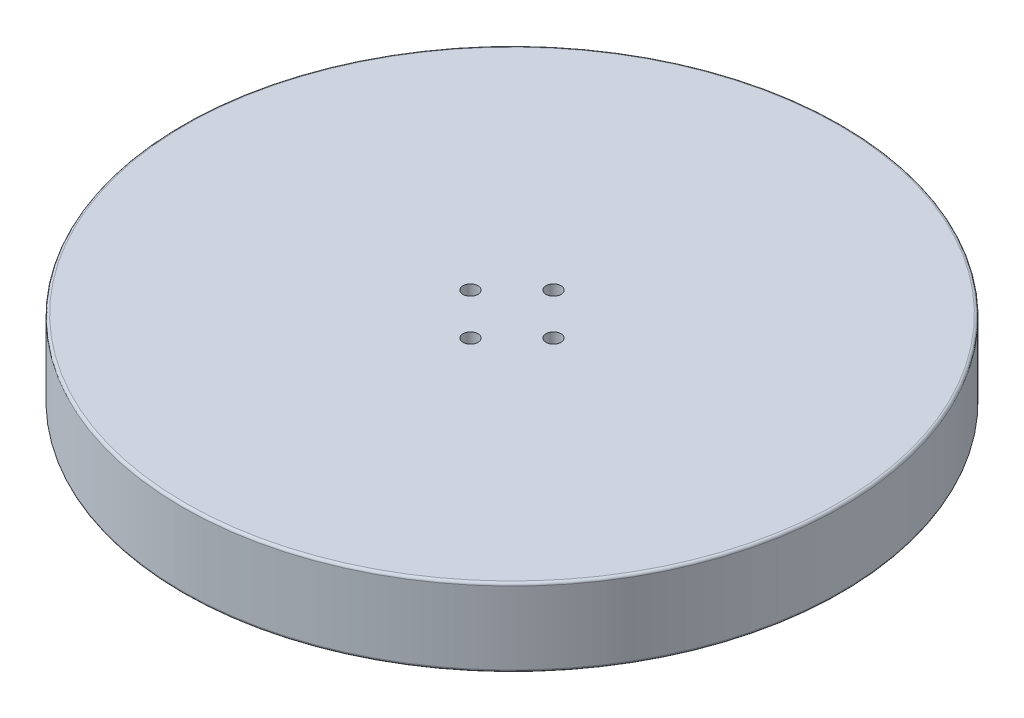
ISO-10303-21;
HEADER;
FILE_DESCRIPTION(('STEP AP214'),'2;1');
FILE_NAME('part.step','',(''),(''),'','','');
FILE_SCHEMA(('AUTOMOTIVE_DESIGN { 1 0 10303 214 1 1 1 1 }'));
ENDSEC;
DATA;
#1=APPLICATION_CONTEXT('core data for automotive mechanical design processes');
#2=APPLICATION_PROTOCOL_DEFINITION('international standard','automotive_design',2000,#1);
#3=PRODUCT_CONTEXT('',#1,'mechanical');
#4=PRODUCT('Part','Part','',(#3));
#5=PRODUCT_RELATED_PRODUCT_CATEGORY('part','',(#4));
#6=PRODUCT_DEFINITION_FORMATION('','',#4);
#7=PRODUCT_DEFINITION_CONTEXT('part definition',#1,'design');
#8=PRODUCT_DEFINITION('design','',#6,#7);
#9=PRODUCT_DEFINITION_SHAPE('','',#8);
#10=(LENGTH_UNIT() NAMED_UNIT(*) SI_UNIT(.MILLI.,.METRE.));
#11=(NAMED_UNIT(*) PLANE_ANGLE_UNIT() SI_UNIT($,.RADIAN.));
#12=(NAMED_UNIT(*) SI_UNIT($,.STERADIAN.) SOLID_ANGLE_UNIT());
#13=UNCERTAINTY_MEASURE_WITH_UNIT(LENGTH_MEASURE(1.E-05),#10,'distance_accuracy_value','');
#14=(GEOMETRIC_REPRESENTATION_CONTEXT(3) GLOBAL_UNCERTAINTY_ASSIGNED_CONTEXT((#13)) GLOBAL_UNIT_ASSIGNED_CONTEXT((#10,
#11,#12)) REPRESENTATION_CONTEXT('',''));
#15=CARTESIAN_POINT('',(0.,0.,0.));
#16=DIRECTION('',(0.,0.,1.));
#17=DIRECTION('',(1.,0.,0.));
#18=AXIS2_PLACEMENT_3D('',#15,#16,#17);
#19=CARTESIAN_POINT('',(0.,15.,0.));
#20=DIRECTION('',(0.,-1.,0.));
#21=DIRECTION('',(0.,0.,-1.));
#22=AXIS2_PLACEMENT_3D('',#19,#20,#21);
#23=CYLINDRICAL_SURFACE('',#22,63.5);
#24=CARTESIAN_POINT('',(0.,14.5,0.));
#25=DIRECTION('',(0.,1.,0.));
#26=DIRECTION('',(0.,0.,1.));
#27=AXIS2_PLACEMENT_3D('',#24,#25,#26);
#28=CIRCLE('',#27,63.5);
#29=CARTESIAN_POINT('',(0.,14.5,63.5));
#30=VERTEX_POINT('',#29);
#31=EDGE_CURVE('E47',#30,#30,#28,.F.);
#32=ORIENTED_EDGE('',*,*,#31,.T.);
#33=EDGE_LOOP('',(#32));
#34=FACE_BOUND('',#33,.T.);
#35=CARTESIAN_POINT('',(0.,0.5,0.));
#36=DIRECTION('',(0.,1.,0.));
#37=DIRECTION('',(0.,0.,1.));
#38=AXIS2_PLACEMENT_3D('',#35,#36,#37);
#39=CIRCLE('',#38,63.5);
#40=CARTESIAN_POINT('',(0.,0.5,63.5));
#41=VERTEX_POINT('',#40);
#42=EDGE_CURVE('E52',#41,#41,#39,.T.);
#43=ORIENTED_EDGE('',*,*,#42,.T.);
#44=EDGE_LOOP('',(#43));
#45=FACE_BOUND('',#44,.T.);
#46=ADVANCED_FACE('F39',(#34,#45),#23,.T.);
#47=CARTESIAN_POINT('',(0.,15.,0.));
#48=DIRECTION('',(0.,1.,0.));
#49=DIRECTION('',(0.,0.,1.));
#50=AXIS2_PLACEMENT_3D('',#47,#48,#49);
#51=PLANE('',#50);
#52=CARTESIAN_POINT('',(0.,15.,0.));
#53=DIRECTION('',(0.,1.,0.));
#54=DIRECTION('',(0.,0.,1.));
#55=AXIS2_PLACEMENT_3D('',#52,#53,#54);
#56=CIRCLE('',#55,63.);
#57=CARTESIAN_POINT('',(0.,15.,63.));
#58=VERTEX_POINT('',#57);
#59=EDGE_CURVE('E57',#58,#58,#56,.T.);
#60=ORIENTED_EDGE('',*,*,#59,.T.);
#61=EDGE_LOOP('',(#60));
#62=FACE_BOUND('',#61,.T.);
#63=CARTESIAN_POINT('',(0.,15.,-8.));
#64=DIRECTION('',(0.,1.,0.));
#65=DIRECTION('',(0.,0.,1.));
#66=AXIS2_PLACEMENT_3D('',#63,#64,#65);
#67=CIRCLE('',#66,1.45);
#68=CARTESIAN_POINT('',(0.,15.,-6.55));
#69=VERTEX_POINT('',#68);
#70=EDGE_CURVE('E88',#69,#69,#67,.T.);
#71=ORIENTED_EDGE('',*,*,#70,.F.);
#72=EDGE_LOOP('',(#71));
#73=FACE_BOUND('',#72,.T.);
#74=CARTESIAN_POINT('',(8.00000000000023,15.,-2.26393958003914E-13));
#75=DIRECTION('',(0.,1.,0.));
#76=DIRECTION('',(0.,0.,1.));
#77=AXIS2_PLACEMENT_3D('',#74,#75,#76);
#78=CIRCLE('',#77,1.45);
#79=CARTESIAN_POINT('',(8.00000000000023,15.,1.44999999999977));
#80=VERTEX_POINT('',#79);
#81=EDGE_CURVE('E80',#80,#80,#78,.T.);
#82=ORIENTED_EDGE('',*,*,#81,.F.);
#83=EDGE_LOOP('',(#82));
#84=FACE_BOUND('',#83,.T.);
#85=CARTESIAN_POINT('',(4.52787916007828E-13,15.,8.));
#86=DIRECTION('',(0.,1.,0.));
#87=DIRECTION('',(0.,0.,1.));
#88=AXIS2_PLACEMENT_3D('',#85,#86,#87);
#89=CIRCLE('',#88,1.45);
#90=CARTESIAN_POINT('',(4.52787916007828E-13,15.,9.45));
#91=VERTEX_POINT('',#90);
#92=EDGE_CURVE('E72',#91,#91,#89,.T.);
#93=ORIENTED_EDGE('',*,*,#92,.F.);
#94=EDGE_LOOP('',(#93));
#95=FACE_BOUND('',#94,.T.);
#96=CARTESIAN_POINT('',(-7.99999999999977,15.,2.27373675443232E-13));
#97=DIRECTION('',(0.,1.,0.));
#98=DIRECTION('',(0.,0.,1.));
#99=AXIS2_PLACEMENT_3D('',#96,#97,#98);
#100=CIRCLE('',#99,1.45);
#101=CARTESIAN_POINT('',(-7.99999999999977,15.,1.45000000000023));
#102=VERTEX_POINT('',#101);
#103=EDGE_CURVE('E64',#102,#102,#100,.T.);
#104=ORIENTED_EDGE('',*,*,#103,.F.);
#105=EDGE_LOOP('',(#104));
#106=FACE_BOUND('',#105,.T.);
#107=ADVANCED_FACE('F107',(#62,#73,#84,#95,#106),#51,.T.);
#108=CARTESIAN_POINT('',(0.,0.,0.));
#109=DIRECTION('',(0.,1.,0.));
#110=DIRECTION('',(0.,0.,1.));
#111=AXIS2_PLACEMENT_3D('',#108,#109,#110);
#112=PLANE('',#111);
#113=CARTESIAN_POINT('',(0.,0.,0.));
#114=DIRECTION('',(0.,1.,0.));
#115=DIRECTION('',(0.,0.,1.));
#116=AXIS2_PLACEMENT_3D('',#113,#114,#115);
#117=CIRCLE('',#116,63.);
#118=CARTESIAN_POINT('',(0.,0.,63.));
#119=VERTEX_POINT('',#118);
#120=EDGE_CURVE('E10',#119,#119,#117,.F.);
#121=ORIENTED_EDGE('',*,*,#120,.T.);
#122=EDGE_LOOP('',(#121));
#123=FACE_BOUND('',#122,.T.);
#124=CARTESIAN_POINT('',(0.,0.,-8.));
#125=DIRECTION('',(0.,1.,0.));
#126=DIRECTION('',(0.,0.,1.));
#127=AXIS2_PLACEMENT_3D('',#124,#125,#126);
#128=CIRCLE('',#127,1.45);
#129=CARTESIAN_POINT('',(0.,0.,-6.55));
#130=VERTEX_POINT('',#129);
#131=EDGE_CURVE('E63',#130,#130,#128,.T.);
#132=ORIENTED_EDGE('',*,*,#131,.T.);
#133=EDGE_LOOP('',(#132));
#134=FACE_BOUND('',#133,.T.);
#135=CARTESIAN_POINT('',(8.00000000000023,0.,-2.26393958003914E-13));
#136=DIRECTION('',(0.,1.,0.));
#137=DIRECTION('',(0.,0.,1.));
#138=AXIS2_PLACEMENT_3D('',#135,#136,#137);
#139=CIRCLE('',#138,1.45);
#140=CARTESIAN_POINT('',(8.00000000000023,0.,1.44999999999977));
#141=VERTEX_POINT('',#140);
#142=EDGE_CURVE('E84',#141,#141,#139,.T.);
#143=ORIENTED_EDGE('',*,*,#142,.T.);
#144=EDGE_LOOP('',(#143));
#145=FACE_BOUND('',#144,.T.);
#146=CARTESIAN_POINT('',(4.52787916007828E-13,0.,8.));
#147=DIRECTION('',(0.,1.,0.));
#148=DIRECTION('',(0.,0.,1.));
#149=AXIS2_PLACEMENT_3D('',#146,#147,#148);
#150=CIRCLE('',#149,1.45);
#151=CARTESIAN_POINT('',(4.52787916007828E-13,0.,9.45));
#152=VERTEX_POINT('',#151);
#153=EDGE_CURVE('E76',#152,#152,#150,.T.);
#154=ORIENTED_EDGE('',*,*,#153,.T.);
#155=EDGE_LOOP('',(#154));
#156=FACE_BOUND('',#155,.T.);
#157=CARTESIAN_POINT('',(-7.99999999999977,0.,2.27373675443232E-13));
#158=DIRECTION('',(0.,1.,0.));
#159=DIRECTION('',(0.,0.,1.));
#160=AXIS2_PLACEMENT_3D('',#157,#158,#159);
#161=CIRCLE('',#160,1.45);
#162=CARTESIAN_POINT('',(-7.99999999999977,0.,1.45000000000023));
#163=VERTEX_POINT('',#162);
#164=EDGE_CURVE('E68',#163,#163,#161,.T.);
#165=ORIENTED_EDGE('',*,*,#164,.T.);
#166=EDGE_LOOP('',(#165));
#167=FACE_BOUND('',#166,.T.);
#168=ADVANCED_FACE('F96',(#123,#134,#145,#156,#167),#112,.F.);
#169=CARTESIAN_POINT('',(-7.99999999999977,0.,2.27373675443232E-13));
#170=DIRECTION('',(0.,1.,0.));
#171=DIRECTION('',(0.,0.,1.));
#172=AXIS2_PLACEMENT_3D('',#169,#170,#171);
#173=CYLINDRICAL_SURFACE('',#172,1.45);
#174=ORIENTED_EDGE('',*,*,#164,.F.);
#175=EDGE_LOOP('',(#174));
#176=FACE_BOUND('',#175,.T.);
#177=ORIENTED_EDGE('',*,*,#103,.T.);
#178=EDGE_LOOP('',(#177));
#179=FACE_BOUND('',#178,.T.);
#180=ADVANCED_FACE('F118',(#176,#179),#173,.F.);
#181=CARTESIAN_POINT('',(4.52787916007828E-13,0.,8.));
#182=DIRECTION('',(0.,1.,0.));
#183=DIRECTION('',(0.,0.,1.));
#184=AXIS2_PLACEMENT_3D('',#181,#182,#183);
#185=CYLINDRICAL_SURFACE('',#184,1.45);
#186=ORIENTED_EDGE('',*,*,#153,.F.);
#187=EDGE_LOOP('',(#186));
#188=FACE_BOUND('',#187,.T.);
#189=ORIENTED_EDGE('',*,*,#92,.T.);
#190=EDGE_LOOP('',(#189));
#191=FACE_BOUND('',#190,.T.);
#192=ADVANCED_FACE('F120',(#188,#191),#185,.F.);
#193=CARTESIAN_POINT('',(8.00000000000023,0.,-2.26393958003914E-13));
#194=DIRECTION('',(0.,1.,0.));
#195=DIRECTION('',(0.,0.,1.));
#196=AXIS2_PLACEMENT_3D('',#193,#194,#195);
#197=CYLINDRICAL_SURFACE('',#196,1.45);
#198=ORIENTED_EDGE('',*,*,#142,.F.);
#199=EDGE_LOOP('',(#198));
#200=FACE_BOUND('',#199,.T.);
#201=ORIENTED_EDGE('',*,*,#81,.T.);
#202=EDGE_LOOP('',(#201));
#203=FACE_BOUND('',#202,.T.);
#204=ADVANCED_FACE('F103',(#200,#203),#197,.F.);
#205=CARTESIAN_POINT('',(0.,0.,-8.));
#206=DIRECTION('',(0.,1.,0.));
#207=DIRECTION('',(0.,0.,1.));
#208=AXIS2_PLACEMENT_3D('',#205,#206,#207);
#209=CYLINDRICAL_SURFACE('',#208,1.45);
#210=ORIENTED_EDGE('',*,*,#131,.F.);
#211=EDGE_LOOP('',(#210));
#212=FACE_BOUND('',#211,.T.);
#213=ORIENTED_EDGE('',*,*,#70,.T.);
#214=EDGE_LOOP('',(#213));
#215=FACE_BOUND('',#214,.T.);
#216=ADVANCED_FACE('F99',(#212,#215),#209,.F.);
#217=CARTESIAN_POINT('',(0.,14.5,0.));
#218=DIRECTION('',(0.,1.,0.));
#219=DIRECTION('',(0.,0.,1.));
#220=AXIS2_PLACEMENT_3D('',#217,#218,#219);
#221=TOROIDAL_SURFACE('',#220,63.,0.5);
#222=ORIENTED_EDGE('',*,*,#31,.F.);
#223=EDGE_LOOP('',(#222));
#224=FACE_BOUND('',#223,.T.);
#225=ORIENTED_EDGE('',*,*,#59,.F.);
#226=EDGE_LOOP('',(#225));
#227=FACE_BOUND('',#226,.T.);
#228=ADVANCED_FACE('F102',(#224,#227),#221,.T.);
#229=CARTESIAN_POINT('',(0.,0.5,0.));
#230=DIRECTION('',(0.,1.,0.));
#231=DIRECTION('',(0.,0.,1.));
#232=AXIS2_PLACEMENT_3D('',#229,#230,#231);
#233=TOROIDAL_SURFACE('',#232,63.,0.5);
#234=ORIENTED_EDGE('',*,*,#120,.F.);
#235=EDGE_LOOP('',(#234));
#236=FACE_BOUND('',#235,.T.);
#237=ORIENTED_EDGE('',*,*,#42,.F.);
#238=EDGE_LOOP('',(#237));
#239=FACE_BOUND('',#238,.T.);
#240=ADVANCED_FACE('F41',(#236,#239),#233,.T.);
#241=CLOSED_SHELL('',(#46,#107,#168,#180,#192,#204,#216,#228,#240));
#242=MANIFOLD_SOLID_BREP('B2',#241);
#243=ADVANCED_BREP_SHAPE_REPRESENTATION('',(#18,#242),#14);
#244=SHAPE_DEFINITION_REPRESENTATION(#9,#243);
ENDSEC;
END-ISO-10303-21;
